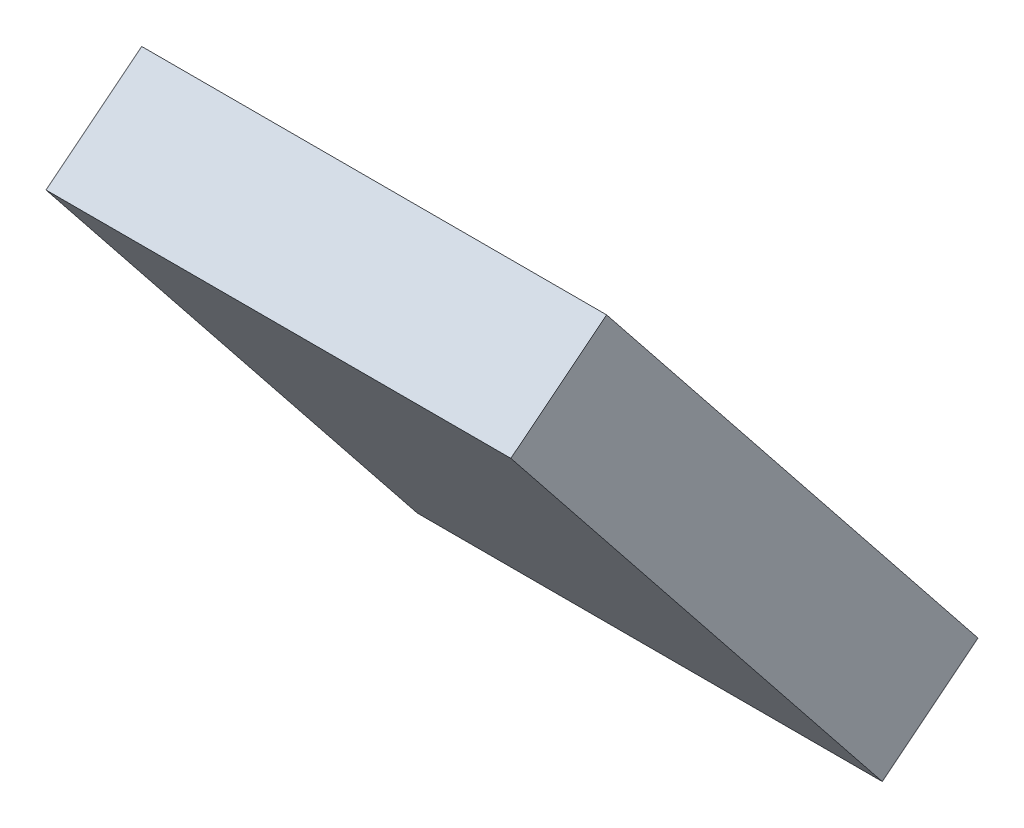
ISO-10303-21;
HEADER;
FILE_DESCRIPTION(('STEP AP214'),'2;1');
FILE_NAME('part.step','',(''),(''),'','','');
FILE_SCHEMA(('AUTOMOTIVE_DESIGN { 1 0 10303 214 1 1 1 1 }'));
ENDSEC;
DATA;
#1=APPLICATION_CONTEXT('core data for automotive mechanical design processes');
#2=APPLICATION_PROTOCOL_DEFINITION('international standard','automotive_design',2000,#1);
#3=PRODUCT_CONTEXT('',#1,'mechanical');
#4=PRODUCT('Part','Part','',(#3));
#5=PRODUCT_RELATED_PRODUCT_CATEGORY('part','',(#4));
#6=PRODUCT_DEFINITION_FORMATION('','',#4);
#7=PRODUCT_DEFINITION_CONTEXT('part definition',#1,'design');
#8=PRODUCT_DEFINITION('design','',#6,#7);
#9=PRODUCT_DEFINITION_SHAPE('','',#8);
#10=(LENGTH_UNIT() NAMED_UNIT(*) SI_UNIT(.MILLI.,.METRE.));
#11=(NAMED_UNIT(*) PLANE_ANGLE_UNIT() SI_UNIT($,.RADIAN.));
#12=(NAMED_UNIT(*) SI_UNIT($,.STERADIAN.) SOLID_ANGLE_UNIT());
#13=UNCERTAINTY_MEASURE_WITH_UNIT(LENGTH_MEASURE(1.E-05),#10,'distance_accuracy_value','');
#14=(GEOMETRIC_REPRESENTATION_CONTEXT(3) GLOBAL_UNCERTAINTY_ASSIGNED_CONTEXT((#13)) GLOBAL_UNIT_ASSIGNED_CONTEXT((#10,
#11,#12)) REPRESENTATION_CONTEXT('',''));
#15=CARTESIAN_POINT('',(0.,0.,0.));
#16=DIRECTION('',(0.,0.,1.));
#17=DIRECTION('',(1.,0.,0.));
#18=AXIS2_PLACEMENT_3D('',#15,#16,#17);
#19=CARTESIAN_POINT('',(-392.796966999625,-76.5119213000356,-69.9869694941648));
#20=DIRECTION('',(0.,-0.781749432604839,-0.623592675247242));
#21=DIRECTION('',(0.,0.623592675247243,-0.781749432604839));
#22=AXIS2_PLACEMENT_3D('',#19,#20,#21);
#23=PLANE('',#22);
#24=DIRECTION('',(1.,0.,0.));
#25=VECTOR('',#24,1.);
#26=CARTESIAN_POINT('',(-392.796966999625,-76.5119213000356,-69.9869694941648));
#27=LINE('',#26,#25);
#28=CARTESIAN_POINT('',(-302.29,-76.5119213000357,-69.9869694941649));
#29=VERTEX_POINT('',#28);
#30=CARTESIAN_POINT('',(-287.11,-76.5119213000357,-69.9869694941649));
#31=VERTEX_POINT('',#30);
#32=EDGE_CURVE('E38',#29,#31,#27,.T.);
#33=ORIENTED_EDGE('',*,*,#32,.T.);
#34=DIRECTION('',(0.,-0.623592675247243,0.781749432604839));
#35=VECTOR('',#34,1.);
#36=CARTESIAN_POINT('',(-287.11,-75.2647359495412,-71.5504683593746));
#37=LINE('',#36,#35);
#38=CARTESIAN_POINT('',(-287.11,-79.0062920010245,-66.8599717637455));
#39=VERTEX_POINT('',#38);
#40=EDGE_CURVE('E43',#31,#39,#37,.T.);
#41=ORIENTED_EDGE('',*,*,#40,.T.);
#42=DIRECTION('',(-1.,0.,0.));
#43=VECTOR('',#42,1.);
#44=CARTESIAN_POINT('',(-258.7,-79.0062920010245,-66.8599717637455));
#45=LINE('',#44,#43);
#46=CARTESIAN_POINT('',(-302.29,-79.0062920010246,-66.8599717637455));
#47=VERTEX_POINT('',#46);
#48=EDGE_CURVE('E11',#39,#47,#45,.T.);
#49=ORIENTED_EDGE('',*,*,#48,.T.);
#50=DIRECTION('',(0.,-0.623592675247243,0.781749432604839));
#51=VECTOR('',#50,1.);
#52=CARTESIAN_POINT('',(-302.29,-75.2647359495412,-71.5504683593746));
#53=LINE('',#52,#51);
#54=EDGE_CURVE('E98',#29,#47,#53,.T.);
#55=ORIENTED_EDGE('',*,*,#54,.F.);
#56=EDGE_LOOP('',(#33,#41,#49,#55));
#57=FACE_BOUND('',#56,.T.);
#58=ADVANCED_FACE('F34',(#57),#23,.T.);
#59=CARTESIAN_POINT('',(-330.7,-66.5322973271817,-56.9096073819482));
#60=DIRECTION('',(0.,0.623592675247241,-0.78174943260484));
#61=DIRECTION('',(0.,0.78174943260484,0.623592675247241));
#62=AXIS2_PLACEMENT_3D('',#59,#60,#61);
#63=PLANE('',#62);
#64=DIRECTION('',(1.,0.,0.));
#65=VECTOR('',#64,1.);
#66=CARTESIAN_POINT('',(-330.7,-63.8022916600614,-54.7319127570514));
#67=LINE('',#66,#65);
#68=CARTESIAN_POINT('',(-302.29,-63.8022916600613,-54.7319127570514));
#69=VERTEX_POINT('',#68);
#70=CARTESIAN_POINT('',(-287.11,-63.8022916600615,-54.7319127570513));
#71=VERTEX_POINT('',#70);
#72=EDGE_CURVE('E94',#69,#71,#67,.T.);
#73=ORIENTED_EDGE('',*,*,#72,.F.);
#74=DIRECTION('',(0.,-0.78174943260484,-0.623592675247241));
#75=VECTOR('',#74,1.);
#76=CARTESIAN_POINT('',(-302.29,-66.5322973271817,-56.9096073819482));
#77=LINE('',#76,#75);
#78=EDGE_CURVE('E59',#69,#47,#77,.T.);
#79=ORIENTED_EDGE('',*,*,#78,.T.);
#80=ORIENTED_EDGE('',*,*,#48,.F.);
#81=DIRECTION('',(0.,-0.78174943260484,-0.623592675247241));
#82=VECTOR('',#81,1.);
#83=CARTESIAN_POINT('',(-287.11,-66.5322973271817,-56.9096073819482));
#84=LINE('',#83,#82);
#85=EDGE_CURVE('E76',#71,#39,#84,.T.);
#86=ORIENTED_EDGE('',*,*,#85,.F.);
#87=EDGE_LOOP('',(#73,#79,#80,#86));
#88=FACE_BOUND('',#87,.T.);
#89=ADVANCED_FACE('F36',(#88),#63,.F.);
#90=CARTESIAN_POINT('',(-392.796966999625,-61.073396129291,-57.6718326848965));
#91=DIRECTION('',(0.,0.623592675247241,-0.78174943260484));
#92=DIRECTION('',(0.,0.78174943260484,0.623592675247241));
#93=AXIS2_PLACEMENT_3D('',#90,#91,#92);
#94=PLANE('',#93);
#95=DIRECTION('',(0.,-0.78174943260484,-0.623592675247241));
#96=VECTOR('',#95,1.);
#97=CARTESIAN_POINT('',(-302.29,-61.073396129291,-57.6718326848965));
#98=LINE('',#97,#96);
#99=CARTESIAN_POINT('',(-302.29,-61.3079209590724,-57.8589104874707));
#100=VERTEX_POINT('',#99);
#101=EDGE_CURVE('E92',#100,#29,#98,.T.);
#102=ORIENTED_EDGE('',*,*,#101,.F.);
#103=DIRECTION('',(-1.,0.,0.));
#104=VECTOR('',#103,1.);
#105=CARTESIAN_POINT('',(-302.29,-61.3079209590724,-57.8589104874707));
#106=LINE('',#105,#104);
#107=CARTESIAN_POINT('',(-287.11,-61.3079209590725,-57.8589104874707));
#108=VERTEX_POINT('',#107);
#109=EDGE_CURVE('E85',#100,#108,#106,.F.);
#110=ORIENTED_EDGE('',*,*,#109,.T.);
#111=DIRECTION('',(0.,-0.78174943260484,-0.623592675247241));
#112=VECTOR('',#111,1.);
#113=CARTESIAN_POINT('',(-287.11,-61.073396129291,-57.6718326848965));
#114=LINE('',#113,#112);
#115=EDGE_CURVE('E70',#108,#31,#114,.T.);
#116=ORIENTED_EDGE('',*,*,#115,.T.);
#117=ORIENTED_EDGE('',*,*,#32,.F.);
#118=EDGE_LOOP('',(#102,#110,#116,#117));
#119=FACE_BOUND('',#118,.T.);
#120=ADVANCED_FACE('F96',(#119),#94,.T.);
#121=CARTESIAN_POINT('',(-302.29,-51.812252971396,-52.8426881019573));
#122=DIRECTION('',(1.,0.,0.));
#123=DIRECTION('',(0.,0.,-1.));
#124=AXIS2_PLACEMENT_3D('',#121,#122,#123);
#125=PLANE('',#124);
#126=DIRECTION('',(0.,0.623592675247241,-0.78174943260484));
#127=VECTOR('',#126,1.);
#128=CARTESIAN_POINT('',(-302.29,-386.430774690043,349.722218220114));
#129=LINE('',#128,#127);
#130=EDGE_CURVE('E81',#69,#100,#129,.T.);
#131=ORIENTED_EDGE('',*,*,#130,.T.);
#132=ORIENTED_EDGE('',*,*,#101,.T.);
#133=ORIENTED_EDGE('',*,*,#54,.T.);
#134=ORIENTED_EDGE('',*,*,#78,.F.);
#135=EDGE_LOOP('',(#131,#132,#133,#134));
#136=FACE_BOUND('',#135,.T.);
#137=ADVANCED_FACE('F90',(#136),#125,.F.);
#138=CARTESIAN_POINT('',(-287.11,-51.812252971396,-52.8426881019573));
#139=DIRECTION('',(1.,0.,0.));
#140=DIRECTION('',(0.,0.,-1.));
#141=AXIS2_PLACEMENT_3D('',#138,#139,#140);
#142=PLANE('',#141);
#143=ORIENTED_EDGE('',*,*,#115,.F.);
#144=DIRECTION('',(0.,0.623592675247241,-0.78174943260484));
#145=VECTOR('',#144,1.);
#146=CARTESIAN_POINT('',(-287.11,-386.430774690043,349.722218220114));
#147=LINE('',#146,#145);
#148=EDGE_CURVE('E50',#71,#108,#147,.T.);
#149=ORIENTED_EDGE('',*,*,#148,.F.);
#150=ORIENTED_EDGE('',*,*,#85,.T.);
#151=ORIENTED_EDGE('',*,*,#40,.F.);
#152=EDGE_LOOP('',(#143,#149,#150,#151));
#153=FACE_BOUND('',#152,.T.);
#154=ADVANCED_FACE('F108',(#153),#142,.T.);
#155=CARTESIAN_POINT('',(-302.29,-386.430774690043,349.722218220114));
#156=DIRECTION('',(0.,0.78174943260484,0.623592675247241));
#157=DIRECTION('',(0.,-0.623592675247241,0.78174943260484));
#158=AXIS2_PLACEMENT_3D('',#155,#156,#157);
#159=PLANE('',#158);
#160=ORIENTED_EDGE('',*,*,#72,.T.);
#161=ORIENTED_EDGE('',*,*,#148,.T.);
#162=ORIENTED_EDGE('',*,*,#109,.F.);
#163=ORIENTED_EDGE('',*,*,#130,.F.);
#164=EDGE_LOOP('',(#160,#161,#162,#163));
#165=FACE_BOUND('',#164,.T.);
#166=ADVANCED_FACE('F86',(#165),#159,.T.);
#167=CLOSED_SHELL('',(#58,#89,#120,#137,#154,#166));
#168=MANIFOLD_SOLID_BREP('B2',#167);
#169=ADVANCED_BREP_SHAPE_REPRESENTATION('',(#18,#168),#14);
#170=SHAPE_DEFINITION_REPRESENTATION(#9,#169);
ENDSEC;
END-ISO-10303-21;
